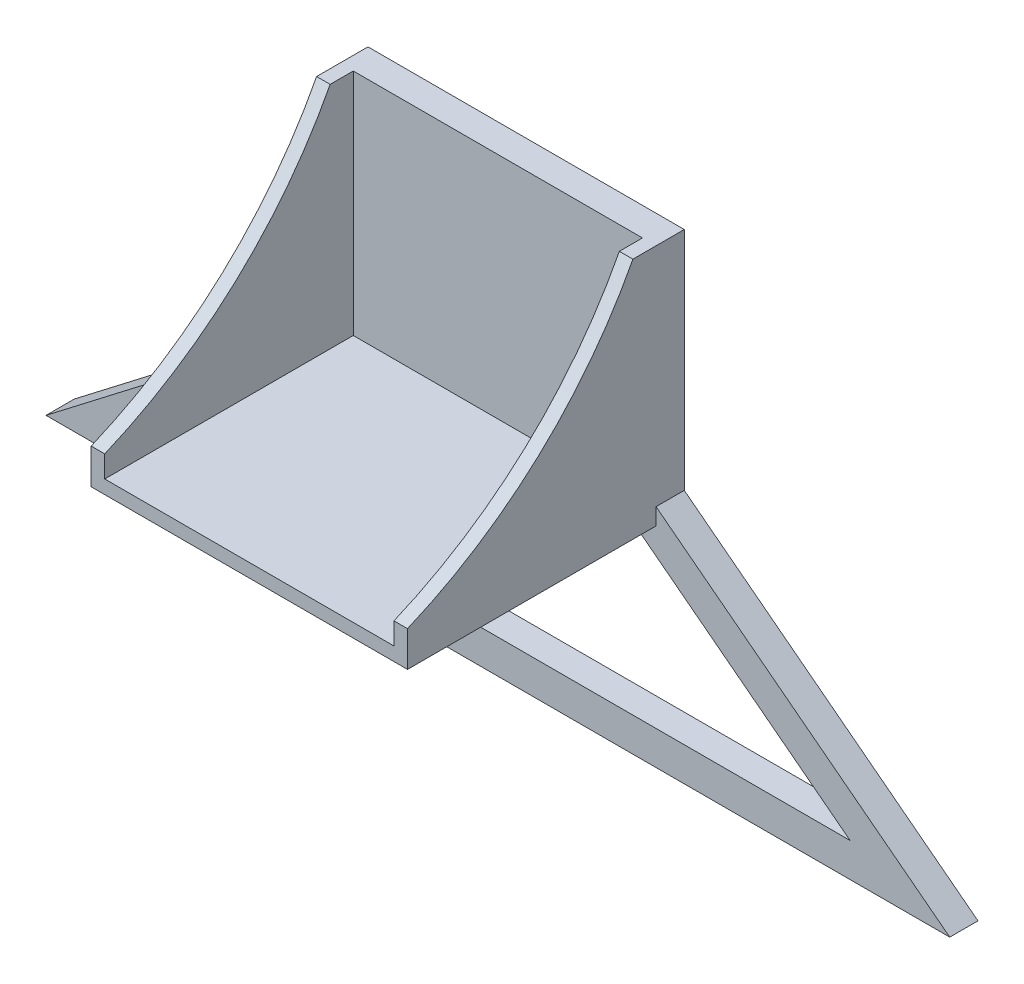
ISO-10303-21;
HEADER;
FILE_DESCRIPTION(('STEP AP214'),'2;1');
FILE_NAME('part.step','',(''),(''),'','','');
FILE_SCHEMA(('AUTOMOTIVE_DESIGN { 1 0 10303 214 1 1 1 1 }'));
ENDSEC;
DATA;
#1=APPLICATION_CONTEXT('core data for automotive mechanical design processes');
#2=APPLICATION_PROTOCOL_DEFINITION('international standard','automotive_design',2000,#1);
#3=PRODUCT_CONTEXT('',#1,'mechanical');
#4=PRODUCT('Part','Part','',(#3));
#5=PRODUCT_RELATED_PRODUCT_CATEGORY('part','',(#4));
#6=PRODUCT_DEFINITION_FORMATION('','',#4);
#7=PRODUCT_DEFINITION_CONTEXT('part definition',#1,'design');
#8=PRODUCT_DEFINITION('design','',#6,#7);
#9=PRODUCT_DEFINITION_SHAPE('','',#8);
#10=(LENGTH_UNIT() NAMED_UNIT(*) SI_UNIT(.MILLI.,.METRE.));
#11=(NAMED_UNIT(*) PLANE_ANGLE_UNIT() SI_UNIT($,.RADIAN.));
#12=(NAMED_UNIT(*) SI_UNIT($,.STERADIAN.) SOLID_ANGLE_UNIT());
#13=UNCERTAINTY_MEASURE_WITH_UNIT(LENGTH_MEASURE(1.E-05),#10,'distance_accuracy_value','');
#14=(GEOMETRIC_REPRESENTATION_CONTEXT(3) GLOBAL_UNCERTAINTY_ASSIGNED_CONTEXT((#13)) GLOBAL_UNIT_ASSIGNED_CONTEXT((#10,
#11,#12)) REPRESENTATION_CONTEXT('',''));
#15=CARTESIAN_POINT('',(0.,0.,0.));
#16=DIRECTION('',(0.,0.,1.));
#17=DIRECTION('',(1.,0.,0.));
#18=AXIS2_PLACEMENT_3D('',#15,#16,#17);
#19=CARTESIAN_POINT('',(0.,0.,2.5));
#20=DIRECTION('',(0.,0.,-1.));
#21=DIRECTION('',(-1.,0.,0.));
#22=AXIS2_PLACEMENT_3D('',#19,#20,#21);
#23=PLANE('',#22);
#24=DIRECTION('',(-0.7926239891046,0.609710760849693,0.));
#25=VECTOR('',#24,1.);
#26=CARTESIAN_POINT('',(14.,-20.,2.5));
#27=LINE('',#26,#25);
#28=CARTESIAN_POINT('',(40.,-40.,2.5));
#29=VERTEX_POINT('',#28);
#30=CARTESIAN_POINT('',(14.,-20.,2.5));
#31=VERTEX_POINT('',#30);
#32=EDGE_CURVE('E253',#29,#31,#27,.T.);
#33=ORIENTED_EDGE('',*,*,#32,.T.);
#34=DIRECTION('',(0.,-1.,0.));
#35=VECTOR('',#34,1.);
#36=CARTESIAN_POINT('',(14.,0.,2.5));
#37=LINE('',#36,#35);
#38=CARTESIAN_POINT('',(14.,-21.4772044923516,2.5));
#39=VERTEX_POINT('',#38);
#40=EDGE_CURVE('E162',#31,#39,#37,.T.);
#41=ORIENTED_EDGE('',*,*,#40,.T.);
#42=DIRECTION('',(1.,0.,0.));
#43=VECTOR('',#42,1.);
#44=CARTESIAN_POINT('',(0.,-21.4772044923516,2.5));
#45=LINE('',#44,#43);
#46=CARTESIAN_POINT('',(11.,-21.4772044923516,2.5));
#47=VERTEX_POINT('',#46);
#48=EDGE_CURVE('E197',#47,#39,#45,.T.);
#49=ORIENTED_EDGE('',*,*,#48,.F.);
#50=DIRECTION('',(-0.7926239891046,0.609710760849693,0.));
#51=VECTOR('',#50,1.);
#52=CARTESIAN_POINT('',(11.,-21.4772044923516,2.5));
#53=LINE('',#52,#51);
#54=CARTESIAN_POINT('',(31.179634159943,-37.,2.5));
#55=VERTEX_POINT('',#54);
#56=EDGE_CURVE('E221',#55,#47,#53,.T.);
#57=ORIENTED_EDGE('',*,*,#56,.F.);
#58=DIRECTION('',(1.,0.,0.));
#59=VECTOR('',#58,1.);
#60=CARTESIAN_POINT('',(31.179634159943,-37.,2.5));
#61=LINE('',#60,#59);
#62=CARTESIAN_POINT('',(-31.179634159943,-37.,2.5));
#63=VERTEX_POINT('',#62);
#64=EDGE_CURVE('E217',#63,#55,#61,.T.);
#65=ORIENTED_EDGE('',*,*,#64,.F.);
#66=DIRECTION('',(-0.7926239891046,-0.609710760849693,0.));
#67=VECTOR('',#66,1.);
#68=CARTESIAN_POINT('',(-11.,-21.4772044923515,2.5));
#69=LINE('',#68,#67);
#70=CARTESIAN_POINT('',(-11.,-21.4772044923515,2.5));
#71=VERTEX_POINT('',#70);
#72=EDGE_CURVE('E215',#71,#63,#69,.T.);
#73=ORIENTED_EDGE('',*,*,#72,.F.);
#74=CARTESIAN_POINT('',(-14.,-21.4772044923516,2.5));
#75=VERTEX_POINT('',#74);
#76=EDGE_CURVE('E193',#75,#71,#45,.T.);
#77=ORIENTED_EDGE('',*,*,#76,.F.);
#78=DIRECTION('',(0.,-1.,0.));
#79=VECTOR('',#78,1.);
#80=CARTESIAN_POINT('',(-14.,0.,2.5));
#81=LINE('',#80,#79);
#82=CARTESIAN_POINT('',(-14.,-20.,2.5));
#83=VERTEX_POINT('',#82);
#84=EDGE_CURVE('E194',#83,#75,#81,.T.);
#85=ORIENTED_EDGE('',*,*,#84,.F.);
#86=DIRECTION('',(-0.7926239891046,-0.609710760849693,0.));
#87=VECTOR('',#86,1.);
#88=CARTESIAN_POINT('',(-14.,-20.,2.5));
#89=LINE('',#88,#87);
#90=CARTESIAN_POINT('',(-40.,-40.,2.5));
#91=VERTEX_POINT('',#90);
#92=EDGE_CURVE('E248',#83,#91,#89,.T.);
#93=ORIENTED_EDGE('',*,*,#92,.T.);
#94=DIRECTION('',(1.,0.,0.));
#95=VECTOR('',#94,1.);
#96=CARTESIAN_POINT('',(40.,-40.,2.5));
#97=LINE('',#96,#95);
#98=EDGE_CURVE('E251',#91,#29,#97,.T.);
#99=ORIENTED_EDGE('',*,*,#98,.T.);
#100=EDGE_LOOP('',(#33,#41,#49,#57,#65,#73,#77,#85,#93,#99));
#101=FACE_BOUND('',#100,.T.);
#102=ADVANCED_FACE('F34',(#101),#23,.F.);
#103=DIRECTION('',(-1.,0.,0.));
#104=VECTOR('',#103,1.);
#105=CARTESIAN_POINT('',(-14.,0.,2.5));
#106=LINE('',#105,#104);
#107=CARTESIAN_POINT('',(12.8,0.,2.5));
#108=VERTEX_POINT('',#107);
#109=CARTESIAN_POINT('',(-12.8,0.,2.5));
#110=VERTEX_POINT('',#109);
#111=EDGE_CURVE('E245',#108,#110,#106,.T.);
#112=ORIENTED_EDGE('',*,*,#111,.T.);
#113=DIRECTION('',(0.,-1.,0.));
#114=VECTOR('',#113,1.);
#115=CARTESIAN_POINT('',(-12.8,0.,2.5));
#116=LINE('',#115,#114);
#117=CARTESIAN_POINT('',(-12.8,-20.2772044923516,2.5));
#118=VERTEX_POINT('',#117);
#119=EDGE_CURVE('E191',#110,#118,#116,.T.);
#120=ORIENTED_EDGE('',*,*,#119,.T.);
#121=DIRECTION('',(1.,0.,0.));
#122=VECTOR('',#121,1.);
#123=CARTESIAN_POINT('',(0.,-20.2772044923516,2.5));
#124=LINE('',#123,#122);
#125=CARTESIAN_POINT('',(12.8,-20.2772044923516,2.5));
#126=VERTEX_POINT('',#125);
#127=EDGE_CURVE('E188',#118,#126,#124,.T.);
#128=ORIENTED_EDGE('',*,*,#127,.T.);
#129=DIRECTION('',(0.,-1.,0.));
#130=VECTOR('',#129,1.);
#131=CARTESIAN_POINT('',(12.8,0.,2.5));
#132=LINE('',#131,#130);
#133=EDGE_CURVE('E185',#108,#126,#132,.T.);
#134=ORIENTED_EDGE('',*,*,#133,.F.);
#135=EDGE_LOOP('',(#112,#120,#128,#134));
#136=FACE_BOUND('',#135,.T.);
#137=ADVANCED_FACE('F322',(#136),#23,.F.);
#138=CARTESIAN_POINT('',(0.,0.,0.));
#139=DIRECTION('',(0.,0.,-1.));
#140=DIRECTION('',(-1.,0.,0.));
#141=AXIS2_PLACEMENT_3D('',#138,#139,#140);
#142=PLANE('',#141);
#143=DIRECTION('',(0.,1.,0.));
#144=VECTOR('',#143,1.);
#145=CARTESIAN_POINT('',(14.,0.,0.));
#146=LINE('',#145,#144);
#147=CARTESIAN_POINT('',(14.,-20.,0.));
#148=VERTEX_POINT('',#147);
#149=CARTESIAN_POINT('',(14.,0.,0.));
#150=VERTEX_POINT('',#149);
#151=EDGE_CURVE('E244',#148,#150,#146,.T.);
#152=ORIENTED_EDGE('',*,*,#151,.F.);
#153=DIRECTION('',(-0.7926239891046,0.609710760849693,0.));
#154=VECTOR('',#153,1.);
#155=CARTESIAN_POINT('',(14.,-20.,0.));
#156=LINE('',#155,#154);
#157=CARTESIAN_POINT('',(40.,-40.,0.));
#158=VERTEX_POINT('',#157);
#159=EDGE_CURVE('E249',#158,#148,#156,.T.);
#160=ORIENTED_EDGE('',*,*,#159,.F.);
#161=DIRECTION('',(1.,0.,0.));
#162=VECTOR('',#161,1.);
#163=CARTESIAN_POINT('',(40.,-40.,0.));
#164=LINE('',#163,#162);
#165=CARTESIAN_POINT('',(-40.,-40.,0.));
#166=VERTEX_POINT('',#165);
#167=EDGE_CURVE('E264',#166,#158,#164,.T.);
#168=ORIENTED_EDGE('',*,*,#167,.F.);
#169=DIRECTION('',(-0.7926239891046,-0.609710760849693,0.));
#170=VECTOR('',#169,1.);
#171=CARTESIAN_POINT('',(-14.,-20.,0.));
#172=LINE('',#171,#170);
#173=CARTESIAN_POINT('',(-14.,-20.,0.));
#174=VERTEX_POINT('',#173);
#175=EDGE_CURVE('E262',#174,#166,#172,.T.);
#176=ORIENTED_EDGE('',*,*,#175,.F.);
#177=DIRECTION('',(0.,-1.,0.));
#178=VECTOR('',#177,1.);
#179=CARTESIAN_POINT('',(-14.,0.,0.));
#180=LINE('',#179,#178);
#181=CARTESIAN_POINT('',(-14.,0.,0.));
#182=VERTEX_POINT('',#181);
#183=EDGE_CURVE('E260',#182,#174,#180,.T.);
#184=ORIENTED_EDGE('',*,*,#183,.F.);
#185=DIRECTION('',(-1.,0.,0.));
#186=VECTOR('',#185,1.);
#187=CARTESIAN_POINT('',(-14.,0.,0.));
#188=LINE('',#187,#186);
#189=EDGE_CURVE('E257',#150,#182,#188,.T.);
#190=ORIENTED_EDGE('',*,*,#189,.F.);
#191=EDGE_LOOP('',(#152,#160,#168,#176,#184,#190));
#192=FACE_BOUND('',#191,.T.);
#193=DIRECTION('',(-0.7926239891046,0.609710760849693,0.));
#194=VECTOR('',#193,1.);
#195=CARTESIAN_POINT('',(11.,-21.4772044923516,0.));
#196=LINE('',#195,#194);
#197=CARTESIAN_POINT('',(31.179634159943,-37.,0.));
#198=VERTEX_POINT('',#197);
#199=CARTESIAN_POINT('',(11.,-21.4772044923516,0.));
#200=VERTEX_POINT('',#199);
#201=EDGE_CURVE('E218',#198,#200,#196,.T.);
#202=ORIENTED_EDGE('',*,*,#201,.T.);
#203=DIRECTION('',(-1.,0.,0.));
#204=VECTOR('',#203,1.);
#205=CARTESIAN_POINT('',(-11.,-21.4772044923515,0.));
#206=LINE('',#205,#204);
#207=CARTESIAN_POINT('',(-11.,-21.4772044923515,0.));
#208=VERTEX_POINT('',#207);
#209=EDGE_CURVE('E214',#200,#208,#206,.T.);
#210=ORIENTED_EDGE('',*,*,#209,.T.);
#211=DIRECTION('',(-0.7926239891046,-0.609710760849693,0.));
#212=VECTOR('',#211,1.);
#213=CARTESIAN_POINT('',(-11.,-21.4772044923515,0.));
#214=LINE('',#213,#212);
#215=CARTESIAN_POINT('',(-31.179634159943,-37.,0.));
#216=VERTEX_POINT('',#215);
#217=EDGE_CURVE('E227',#208,#216,#214,.T.);
#218=ORIENTED_EDGE('',*,*,#217,.T.);
#219=DIRECTION('',(1.,0.,0.));
#220=VECTOR('',#219,1.);
#221=CARTESIAN_POINT('',(31.179634159943,-37.,0.));
#222=LINE('',#221,#220);
#223=EDGE_CURVE('E230',#216,#198,#222,.T.);
#224=ORIENTED_EDGE('',*,*,#223,.T.);
#225=EDGE_LOOP('',(#202,#210,#218,#224));
#226=FACE_BOUND('',#225,.T.);
#227=ADVANCED_FACE('F287',(#192,#226),#142,.T.);
#228=CARTESIAN_POINT('',(14.,0.,2.5));
#229=DIRECTION('',(-1.,0.,0.));
#230=DIRECTION('',(0.,-1.,0.));
#231=AXIS2_PLACEMENT_3D('',#228,#229,#230);
#232=PLANE('',#231);
#233=DIRECTION('',(0.,0.,-1.));
#234=VECTOR('',#233,1.);
#235=CARTESIAN_POINT('',(14.,0.,2.5));
#236=LINE('',#235,#234);
#237=CARTESIAN_POINT('',(14.,0.,4.54712921945762));
#238=VERTEX_POINT('',#237);
#239=EDGE_CURVE('E169',#238,#150,#236,.T.);
#240=ORIENTED_EDGE('',*,*,#239,.F.);
#241=CARTESIAN_POINT('',(14.,18.5227955076485,40.));
#242=DIRECTION('',(-1.,0.,0.));
#243=DIRECTION('',(0.,-1.,0.));
#244=AXIS2_PLACEMENT_3D('',#241,#242,#243);
#245=CIRCLE('',#244,40.);
#246=CARTESIAN_POINT('',(14.,-18.3519926273361,24.5));
#247=VERTEX_POINT('',#246);
#248=EDGE_CURVE('E157',#238,#247,#245,.T.);
#249=ORIENTED_EDGE('',*,*,#248,.T.);
#250=DIRECTION('',(0.,-1.,0.));
#251=VECTOR('',#250,1.);
#252=CARTESIAN_POINT('',(14.,0.,24.5));
#253=LINE('',#252,#251);
#254=CARTESIAN_POINT('',(14.,-21.4772044923516,24.5));
#255=VERTEX_POINT('',#254);
#256=EDGE_CURVE('E166',#247,#255,#253,.T.);
#257=ORIENTED_EDGE('',*,*,#256,.T.);
#258=DIRECTION('',(0.,0.,-1.));
#259=VECTOR('',#258,1.);
#260=CARTESIAN_POINT('',(14.,-21.4772044923516,24.5));
#261=LINE('',#260,#259);
#262=EDGE_CURVE('E177',#255,#39,#261,.T.);
#263=ORIENTED_EDGE('',*,*,#262,.T.);
#264=ORIENTED_EDGE('',*,*,#40,.F.);
#265=DIRECTION('',(0.,0.,-1.));
#266=VECTOR('',#265,1.);
#267=CARTESIAN_POINT('',(14.,-20.,2.5));
#268=LINE('',#267,#266);
#269=EDGE_CURVE('E255',#31,#148,#268,.T.);
#270=ORIENTED_EDGE('',*,*,#269,.T.);
#271=ORIENTED_EDGE('',*,*,#151,.T.);
#272=EDGE_LOOP('',(#240,#249,#257,#263,#264,#270,#271));
#273=FACE_BOUND('',#272,.T.);
#274=ADVANCED_FACE('F36',(#273),#232,.F.);
#275=CARTESIAN_POINT('',(-14.,0.,2.5));
#276=DIRECTION('',(0.,-1.,0.));
#277=DIRECTION('',(1.,0.,0.));
#278=AXIS2_PLACEMENT_3D('',#275,#276,#277);
#279=PLANE('',#278);
#280=DIRECTION('',(0.,0.,-1.));
#281=VECTOR('',#280,1.);
#282=CARTESIAN_POINT('',(-14.,0.,2.5));
#283=LINE('',#282,#281);
#284=CARTESIAN_POINT('',(-14.,0.,4.54712921945761));
#285=VERTEX_POINT('',#284);
#286=EDGE_CURVE('E278',#285,#182,#283,.T.);
#287=ORIENTED_EDGE('',*,*,#286,.F.);
#288=DIRECTION('',(-1.,0.,0.));
#289=VECTOR('',#288,1.);
#290=CARTESIAN_POINT('',(40.,0.,4.54712921945762));
#291=LINE('',#290,#289);
#292=CARTESIAN_POINT('',(-12.8,0.,4.54712921945761));
#293=VERTEX_POINT('',#292);
#294=EDGE_CURVE('E189',#285,#293,#291,.F.);
#295=ORIENTED_EDGE('',*,*,#294,.T.);
#296=DIRECTION('',(0.,0.,-1.));
#297=VECTOR('',#296,1.);
#298=CARTESIAN_POINT('',(-12.8,0.,24.5));
#299=LINE('',#298,#297);
#300=EDGE_CURVE('E204',#293,#110,#299,.T.);
#301=ORIENTED_EDGE('',*,*,#300,.T.);
#302=ORIENTED_EDGE('',*,*,#111,.F.);
#303=DIRECTION('',(0.,0.,-1.));
#304=VECTOR('',#303,1.);
#305=CARTESIAN_POINT('',(12.8,0.,24.5));
#306=LINE('',#305,#304);
#307=CARTESIAN_POINT('',(12.8,0.,4.54712921945761));
#308=VERTEX_POINT('',#307);
#309=EDGE_CURVE('E212',#308,#108,#306,.T.);
#310=ORIENTED_EDGE('',*,*,#309,.F.);
#311=EDGE_CURVE('E171',#308,#238,#291,.F.);
#312=ORIENTED_EDGE('',*,*,#311,.T.);
#313=ORIENTED_EDGE('',*,*,#239,.T.);
#314=ORIENTED_EDGE('',*,*,#189,.T.);
#315=EDGE_LOOP('',(#287,#295,#301,#302,#310,#312,#313,#314));
#316=FACE_BOUND('',#315,.T.);
#317=ADVANCED_FACE('F282',(#316),#279,.F.);
#318=CARTESIAN_POINT('',(-14.,0.,2.5));
#319=DIRECTION('',(1.,0.,0.));
#320=DIRECTION('',(0.,1.,0.));
#321=AXIS2_PLACEMENT_3D('',#318,#319,#320);
#322=PLANE('',#321);
#323=DIRECTION('',(0.,-1.,0.));
#324=VECTOR('',#323,1.);
#325=CARTESIAN_POINT('',(-14.,0.,24.5));
#326=LINE('',#325,#324);
#327=CARTESIAN_POINT('',(-14.,-18.3519926273361,24.5));
#328=VERTEX_POINT('',#327);
#329=CARTESIAN_POINT('',(-14.,-21.4772044923516,24.5));
#330=VERTEX_POINT('',#329);
#331=EDGE_CURVE('E181',#328,#330,#326,.T.);
#332=ORIENTED_EDGE('',*,*,#331,.F.);
#333=CARTESIAN_POINT('',(-14.,18.5227955076484,40.));
#334=DIRECTION('',(1.,0.,0.));
#335=DIRECTION('',(0.,1.,0.));
#336=AXIS2_PLACEMENT_3D('',#333,#334,#335);
#337=CIRCLE('',#336,40.);
#338=EDGE_CURVE('E48',#328,#285,#337,.T.);
#339=ORIENTED_EDGE('',*,*,#338,.T.);
#340=ORIENTED_EDGE('',*,*,#286,.T.);
#341=ORIENTED_EDGE('',*,*,#183,.T.);
#342=DIRECTION('',(0.,0.,-1.));
#343=VECTOR('',#342,1.);
#344=CARTESIAN_POINT('',(-14.,-20.,2.5));
#345=LINE('',#344,#343);
#346=EDGE_CURVE('E275',#83,#174,#345,.T.);
#347=ORIENTED_EDGE('',*,*,#346,.F.);
#348=ORIENTED_EDGE('',*,*,#84,.T.);
#349=DIRECTION('',(0.,0.,-1.));
#350=VECTOR('',#349,1.);
#351=CARTESIAN_POINT('',(-14.,-21.4772044923516,24.5));
#352=LINE('',#351,#350);
#353=EDGE_CURVE('E179',#330,#75,#352,.T.);
#354=ORIENTED_EDGE('',*,*,#353,.F.);
#355=EDGE_LOOP('',(#332,#339,#340,#341,#347,#348,#354));
#356=FACE_BOUND('',#355,.T.);
#357=ADVANCED_FACE('F308',(#356),#322,.F.);
#358=CARTESIAN_POINT('',(-14.,-20.,2.5));
#359=DIRECTION('',(0.609710760849693,-0.7926239891046,0.));
#360=DIRECTION('',(0.7926239891046,0.609710760849693,0.));
#361=AXIS2_PLACEMENT_3D('',#358,#359,#360);
#362=PLANE('',#361);
#363=ORIENTED_EDGE('',*,*,#175,.T.);
#364=DIRECTION('',(0.,0.,-1.));
#365=VECTOR('',#364,1.);
#366=CARTESIAN_POINT('',(-40.,-40.,2.5));
#367=LINE('',#366,#365);
#368=EDGE_CURVE('E272',#91,#166,#367,.T.);
#369=ORIENTED_EDGE('',*,*,#368,.F.);
#370=ORIENTED_EDGE('',*,*,#92,.F.);
#371=ORIENTED_EDGE('',*,*,#346,.T.);
#372=EDGE_LOOP('',(#363,#369,#370,#371));
#373=FACE_BOUND('',#372,.T.);
#374=ADVANCED_FACE('F304',(#373),#362,.F.);
#375=CARTESIAN_POINT('',(40.,-40.,2.5));
#376=DIRECTION('',(0.,1.,0.));
#377=DIRECTION('',(-1.,0.,0.));
#378=AXIS2_PLACEMENT_3D('',#375,#376,#377);
#379=PLANE('',#378);
#380=ORIENTED_EDGE('',*,*,#167,.T.);
#381=DIRECTION('',(0.,0.,-1.));
#382=VECTOR('',#381,1.);
#383=CARTESIAN_POINT('',(40.,-40.,2.5));
#384=LINE('',#383,#382);
#385=EDGE_CURVE('E269',#29,#158,#384,.T.);
#386=ORIENTED_EDGE('',*,*,#385,.F.);
#387=ORIENTED_EDGE('',*,*,#98,.F.);
#388=ORIENTED_EDGE('',*,*,#368,.T.);
#389=EDGE_LOOP('',(#380,#386,#387,#388));
#390=FACE_BOUND('',#389,.T.);
#391=ADVANCED_FACE('F299',(#390),#379,.F.);
#392=CARTESIAN_POINT('',(14.,-20.,2.5));
#393=DIRECTION('',(-0.609710760849693,-0.7926239891046,0.));
#394=DIRECTION('',(0.7926239891046,-0.609710760849693,0.));
#395=AXIS2_PLACEMENT_3D('',#392,#393,#394);
#396=PLANE('',#395);
#397=ORIENTED_EDGE('',*,*,#159,.T.);
#398=ORIENTED_EDGE('',*,*,#269,.F.);
#399=ORIENTED_EDGE('',*,*,#32,.F.);
#400=ORIENTED_EDGE('',*,*,#385,.T.);
#401=EDGE_LOOP('',(#397,#398,#399,#400));
#402=FACE_BOUND('',#401,.T.);
#403=ADVANCED_FACE('F295',(#402),#396,.F.);
#404=CARTESIAN_POINT('',(-11.,-21.4772044923515,2.5));
#405=DIRECTION('',(0.,-1.,0.));
#406=DIRECTION('',(1.,0.,0.));
#407=AXIS2_PLACEMENT_3D('',#404,#405,#406);
#408=PLANE('',#407);
#409=ORIENTED_EDGE('',*,*,#209,.F.);
#410=DIRECTION('',(0.,0.,-1.));
#411=VECTOR('',#410,1.);
#412=CARTESIAN_POINT('',(11.,-21.4772044923516,2.5));
#413=LINE('',#412,#411);
#414=EDGE_CURVE('E224',#47,#200,#413,.T.);
#415=ORIENTED_EDGE('',*,*,#414,.F.);
#416=ORIENTED_EDGE('',*,*,#48,.T.);
#417=ORIENTED_EDGE('',*,*,#262,.F.);
#418=DIRECTION('',(1.,0.,0.));
#419=VECTOR('',#418,1.);
#420=CARTESIAN_POINT('',(0.,-21.4772044923516,24.5));
#421=LINE('',#420,#419);
#422=EDGE_CURVE('E175',#330,#255,#421,.T.);
#423=ORIENTED_EDGE('',*,*,#422,.F.);
#424=ORIENTED_EDGE('',*,*,#353,.T.);
#425=ORIENTED_EDGE('',*,*,#76,.T.);
#426=DIRECTION('',(0.,0.,-1.));
#427=VECTOR('',#426,1.);
#428=CARTESIAN_POINT('',(-11.,-21.4772044923515,2.5));
#429=LINE('',#428,#427);
#430=EDGE_CURVE('E241',#71,#208,#429,.T.);
#431=ORIENTED_EDGE('',*,*,#430,.T.);
#432=EDGE_LOOP('',(#409,#415,#416,#417,#423,#424,#425,#431));
#433=FACE_BOUND('',#432,.T.);
#434=ADVANCED_FACE('F337',(#433),#408,.T.);
#435=CARTESIAN_POINT('',(-11.,-21.4772044923515,2.5));
#436=DIRECTION('',(0.609710760849693,-0.7926239891046,0.));
#437=DIRECTION('',(0.7926239891046,0.609710760849693,0.));
#438=AXIS2_PLACEMENT_3D('',#435,#436,#437);
#439=PLANE('',#438);
#440=ORIENTED_EDGE('',*,*,#217,.F.);
#441=ORIENTED_EDGE('',*,*,#430,.F.);
#442=ORIENTED_EDGE('',*,*,#72,.T.);
#443=DIRECTION('',(0.,0.,-1.));
#444=VECTOR('',#443,1.);
#445=CARTESIAN_POINT('',(-31.179634159943,-37.,2.5));
#446=LINE('',#445,#444);
#447=EDGE_CURVE('E239',#63,#216,#446,.T.);
#448=ORIENTED_EDGE('',*,*,#447,.T.);
#449=EDGE_LOOP('',(#440,#441,#442,#448));
#450=FACE_BOUND('',#449,.T.);
#451=ADVANCED_FACE('F352',(#450),#439,.T.);
#452=CARTESIAN_POINT('',(31.179634159943,-37.,2.5));
#453=DIRECTION('',(0.,1.,0.));
#454=DIRECTION('',(-1.,0.,0.));
#455=AXIS2_PLACEMENT_3D('',#452,#453,#454);
#456=PLANE('',#455);
#457=ORIENTED_EDGE('',*,*,#223,.F.);
#458=ORIENTED_EDGE('',*,*,#447,.F.);
#459=ORIENTED_EDGE('',*,*,#64,.T.);
#460=DIRECTION('',(0.,0.,-1.));
#461=VECTOR('',#460,1.);
#462=CARTESIAN_POINT('',(31.179634159943,-37.,2.5));
#463=LINE('',#462,#461);
#464=EDGE_CURVE('E237',#55,#198,#463,.T.);
#465=ORIENTED_EDGE('',*,*,#464,.T.);
#466=EDGE_LOOP('',(#457,#458,#459,#465));
#467=FACE_BOUND('',#466,.T.);
#468=ADVANCED_FACE('F349',(#467),#456,.T.);
#469=CARTESIAN_POINT('',(11.,-21.4772044923516,2.5));
#470=DIRECTION('',(-0.609710760849693,-0.7926239891046,0.));
#471=DIRECTION('',(0.7926239891046,-0.609710760849693,0.));
#472=AXIS2_PLACEMENT_3D('',#469,#470,#471);
#473=PLANE('',#472);
#474=ORIENTED_EDGE('',*,*,#201,.F.);
#475=ORIENTED_EDGE('',*,*,#464,.F.);
#476=ORIENTED_EDGE('',*,*,#56,.T.);
#477=ORIENTED_EDGE('',*,*,#414,.T.);
#478=EDGE_LOOP('',(#474,#475,#476,#477));
#479=FACE_BOUND('',#478,.T.);
#480=ADVANCED_FACE('F345',(#479),#473,.T.);
#481=CARTESIAN_POINT('',(12.8,0.,24.5));
#482=DIRECTION('',(1.,0.,0.));
#483=DIRECTION('',(0.,1.,0.));
#484=AXIS2_PLACEMENT_3D('',#481,#482,#483);
#485=PLANE('',#484);
#486=DIRECTION('',(0.,-1.,0.));
#487=VECTOR('',#486,1.);
#488=CARTESIAN_POINT('',(12.8,0.,24.5));
#489=LINE('',#488,#487);
#490=CARTESIAN_POINT('',(12.8,-18.3519926273361,24.5));
#491=VERTEX_POINT('',#490);
#492=CARTESIAN_POINT('',(12.8,-20.2772044923516,24.5));
#493=VERTEX_POINT('',#492);
#494=EDGE_CURVE('E200',#491,#493,#489,.T.);
#495=ORIENTED_EDGE('',*,*,#494,.F.);
#496=CARTESIAN_POINT('',(12.8,18.5227955076485,40.));
#497=DIRECTION('',(1.,0.,0.));
#498=DIRECTION('',(0.,1.,0.));
#499=AXIS2_PLACEMENT_3D('',#496,#497,#498);
#500=CIRCLE('',#499,40.);
#501=EDGE_CURVE('E56',#491,#308,#500,.T.);
#502=ORIENTED_EDGE('',*,*,#501,.T.);
#503=ORIENTED_EDGE('',*,*,#309,.T.);
#504=ORIENTED_EDGE('',*,*,#133,.T.);
#505=DIRECTION('',(0.,0.,-1.));
#506=VECTOR('',#505,1.);
#507=CARTESIAN_POINT('',(12.8,-20.2772044923516,24.5));
#508=LINE('',#507,#506);
#509=EDGE_CURVE('E209',#493,#126,#508,.T.);
#510=ORIENTED_EDGE('',*,*,#509,.F.);
#511=EDGE_LOOP('',(#495,#502,#503,#504,#510));
#512=FACE_BOUND('',#511,.T.);
#513=ADVANCED_FACE('F325',(#512),#485,.F.);
#514=CARTESIAN_POINT('',(0.,-20.2772044923516,24.5));
#515=DIRECTION('',(0.,1.,0.));
#516=DIRECTION('',(0.,0.,1.));
#517=AXIS2_PLACEMENT_3D('',#514,#515,#516);
#518=PLANE('',#517);
#519=ORIENTED_EDGE('',*,*,#127,.F.);
#520=DIRECTION('',(0.,0.,-1.));
#521=VECTOR('',#520,1.);
#522=CARTESIAN_POINT('',(-12.8,-20.2772044923516,24.5));
#523=LINE('',#522,#521);
#524=CARTESIAN_POINT('',(-12.8,-20.2772044923516,24.5));
#525=VERTEX_POINT('',#524);
#526=EDGE_CURVE('E206',#525,#118,#523,.T.);
#527=ORIENTED_EDGE('',*,*,#526,.F.);
#528=DIRECTION('',(1.,0.,0.));
#529=VECTOR('',#528,1.);
#530=CARTESIAN_POINT('',(0.,-20.2772044923516,24.5));
#531=LINE('',#530,#529);
#532=EDGE_CURVE('E332',#525,#493,#531,.T.);
#533=ORIENTED_EDGE('',*,*,#532,.T.);
#534=ORIENTED_EDGE('',*,*,#509,.T.);
#535=EDGE_LOOP('',(#519,#527,#533,#534));
#536=FACE_BOUND('',#535,.T.);
#537=ADVANCED_FACE('F436',(#536),#518,.T.);
#538=CARTESIAN_POINT('',(-12.8,0.,24.5));
#539=DIRECTION('',(1.,0.,0.));
#540=DIRECTION('',(0.,1.,0.));
#541=AXIS2_PLACEMENT_3D('',#538,#539,#540);
#542=PLANE('',#541);
#543=CARTESIAN_POINT('',(-12.8,18.5227955076484,40.));
#544=DIRECTION('',(1.,0.,0.));
#545=DIRECTION('',(0.,1.,0.));
#546=AXIS2_PLACEMENT_3D('',#543,#544,#545);
#547=CIRCLE('',#546,40.);
#548=CARTESIAN_POINT('',(-12.8,-18.3519926273361,24.5));
#549=VERTEX_POINT('',#548);
#550=EDGE_CURVE('E170',#549,#293,#547,.T.);
#551=ORIENTED_EDGE('',*,*,#550,.F.);
#552=DIRECTION('',(0.,-1.,0.));
#553=VECTOR('',#552,1.);
#554=CARTESIAN_POINT('',(-12.8,0.,24.5));
#555=LINE('',#554,#553);
#556=EDGE_CURVE('E335',#549,#525,#555,.T.);
#557=ORIENTED_EDGE('',*,*,#556,.T.);
#558=ORIENTED_EDGE('',*,*,#526,.T.);
#559=ORIENTED_EDGE('',*,*,#119,.F.);
#560=ORIENTED_EDGE('',*,*,#300,.F.);
#561=EDGE_LOOP('',(#551,#557,#558,#559,#560));
#562=FACE_BOUND('',#561,.T.);
#563=ADVANCED_FACE('F317',(#562),#542,.T.);
#564=CARTESIAN_POINT('',(0.,0.,24.5));
#565=DIRECTION('',(0.,0.,1.));
#566=DIRECTION('',(1.,0.,0.));
#567=AXIS2_PLACEMENT_3D('',#564,#565,#566);
#568=PLANE('',#567);
#569=DIRECTION('',(-1.,0.,0.));
#570=VECTOR('',#569,1.);
#571=CARTESIAN_POINT('',(40.,-18.3519926273361,24.5));
#572=LINE('',#571,#570);
#573=EDGE_CURVE('E11',#328,#549,#572,.F.);
#574=ORIENTED_EDGE('',*,*,#573,.F.);
#575=ORIENTED_EDGE('',*,*,#331,.T.);
#576=ORIENTED_EDGE('',*,*,#422,.T.);
#577=ORIENTED_EDGE('',*,*,#256,.F.);
#578=EDGE_CURVE('E38',#491,#247,#572,.F.);
#579=ORIENTED_EDGE('',*,*,#578,.F.);
#580=ORIENTED_EDGE('',*,*,#494,.T.);
#581=ORIENTED_EDGE('',*,*,#532,.F.);
#582=ORIENTED_EDGE('',*,*,#556,.F.);
#583=EDGE_LOOP('',(#574,#575,#576,#577,#579,#580,#581,#582));
#584=FACE_BOUND('',#583,.T.);
#585=ADVANCED_FACE('F173',(#584),#568,.T.);
#586=CARTESIAN_POINT('',(40.,18.5227955076485,40.));
#587=DIRECTION('',(-1.,0.,0.));
#588=DIRECTION('',(0.,-1.,0.));
#589=AXIS2_PLACEMENT_3D('',#586,#587,#588);
#590=CYLINDRICAL_SURFACE('',#589,40.);
#591=ORIENTED_EDGE('',*,*,#311,.F.);
#592=ORIENTED_EDGE('',*,*,#501,.F.);
#593=ORIENTED_EDGE('',*,*,#578,.T.);
#594=ORIENTED_EDGE('',*,*,#248,.F.);
#595=EDGE_LOOP('',(#591,#592,#593,#594));
#596=FACE_BOUND('',#595,.T.);
#597=ADVANCED_FACE('F156',(#596),#590,.F.);
#598=ORIENTED_EDGE('',*,*,#338,.F.);
#599=ORIENTED_EDGE('',*,*,#573,.T.);
#600=ORIENTED_EDGE('',*,*,#550,.T.);
#601=ORIENTED_EDGE('',*,*,#294,.F.);
#602=EDGE_LOOP('',(#598,#599,#600,#601));
#603=FACE_BOUND('',#602,.T.);
#604=ADVANCED_FACE('F463',(#603),#590,.F.);
#605=CLOSED_SHELL('',(#102,#137,#227,#274,#317,#357,#374,#391,#403,#434,#451,#468,#480,#513,
#537,#563,#585,#597,#604));
#606=MANIFOLD_SOLID_BREP('B2',#605);
#607=ADVANCED_BREP_SHAPE_REPRESENTATION('',(#18,#606),#14);
#608=SHAPE_DEFINITION_REPRESENTATION(#9,#607);
ENDSEC;
END-ISO-10303-21;
